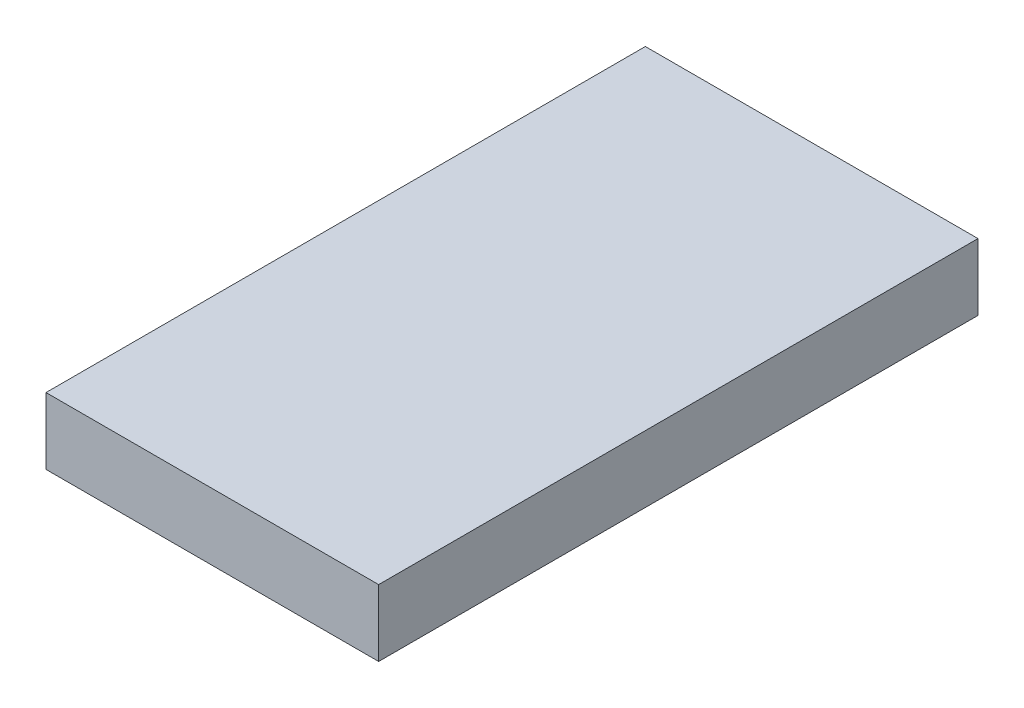
ISO-10303-21;
HEADER;
FILE_DESCRIPTION(('STEP AP214'),'2;1');
FILE_NAME('part.step','',(''),(''),'','','');
FILE_SCHEMA(('AUTOMOTIVE_DESIGN { 1 0 10303 214 1 1 1 1 }'));
ENDSEC;
DATA;
#1=APPLICATION_CONTEXT('core data for automotive mechanical design processes');
#2=APPLICATION_PROTOCOL_DEFINITION('international standard','automotive_design',2000,#1);
#3=PRODUCT_CONTEXT('',#1,'mechanical');
#4=PRODUCT('Part','Part','',(#3));
#5=PRODUCT_RELATED_PRODUCT_CATEGORY('part','',(#4));
#6=PRODUCT_DEFINITION_FORMATION('','',#4);
#7=PRODUCT_DEFINITION_CONTEXT('part definition',#1,'design');
#8=PRODUCT_DEFINITION('design','',#6,#7);
#9=PRODUCT_DEFINITION_SHAPE('','',#8);
#10=(LENGTH_UNIT() NAMED_UNIT(*) SI_UNIT(.MILLI.,.METRE.));
#11=(NAMED_UNIT(*) PLANE_ANGLE_UNIT() SI_UNIT($,.RADIAN.));
#12=(NAMED_UNIT(*) SI_UNIT($,.STERADIAN.) SOLID_ANGLE_UNIT());
#13=UNCERTAINTY_MEASURE_WITH_UNIT(LENGTH_MEASURE(1.E-05),#10,'distance_accuracy_value','');
#14=(GEOMETRIC_REPRESENTATION_CONTEXT(3) GLOBAL_UNCERTAINTY_ASSIGNED_CONTEXT((#13)) GLOBAL_UNIT_ASSIGNED_CONTEXT((#10,
#11,#12)) REPRESENTATION_CONTEXT('',''));
#15=CARTESIAN_POINT('',(0.,0.,0.));
#16=DIRECTION('',(0.,0.,1.));
#17=DIRECTION('',(1.,0.,0.));
#18=AXIS2_PLACEMENT_3D('',#15,#16,#17);
#19=CARTESIAN_POINT('',(63.43777,-12.7,228.6));
#20=DIRECTION('',(-1.,0.,0.));
#21=DIRECTION('',(0.,0.,1.));
#22=AXIS2_PLACEMENT_3D('',#19,#20,#21);
#23=PLANE('',#22);
#24=DIRECTION('',(0.,1.,0.));
#25=VECTOR('',#24,1.);
#26=CARTESIAN_POINT('',(63.43777,-12.7,0.));
#27=LINE('',#26,#25);
#28=CARTESIAN_POINT('',(63.43777,-12.7,0.));
#29=VERTEX_POINT('',#28);
#30=CARTESIAN_POINT('',(63.43777,12.7,0.));
#31=VERTEX_POINT('',#30);
#32=EDGE_CURVE('E106',#29,#31,#27,.T.);
#33=ORIENTED_EDGE('',*,*,#32,.T.);
#34=DIRECTION('',(0.,0.,-1.));
#35=VECTOR('',#34,1.);
#36=CARTESIAN_POINT('',(63.43777,12.7,228.6));
#37=LINE('',#36,#35);
#38=CARTESIAN_POINT('',(63.43777,12.7,228.6));
#39=VERTEX_POINT('',#38);
#40=EDGE_CURVE('E11',#39,#31,#37,.T.);
#41=ORIENTED_EDGE('',*,*,#40,.F.);
#42=DIRECTION('',(0.,1.,0.));
#43=VECTOR('',#42,1.);
#44=CARTESIAN_POINT('',(63.43777,-12.7,228.6));
#45=LINE('',#44,#43);
#46=CARTESIAN_POINT('',(63.43777,-12.7,228.6));
#47=VERTEX_POINT('',#46);
#48=EDGE_CURVE('E94',#47,#39,#45,.T.);
#49=ORIENTED_EDGE('',*,*,#48,.F.);
#50=DIRECTION('',(0.,0.,-1.));
#51=VECTOR('',#50,1.);
#52=CARTESIAN_POINT('',(63.43777,-12.7,228.6));
#53=LINE('',#52,#51);
#54=EDGE_CURVE('E102',#47,#29,#53,.T.);
#55=ORIENTED_EDGE('',*,*,#54,.T.);
#56=EDGE_LOOP('',(#33,#41,#49,#55));
#57=FACE_BOUND('',#56,.T.);
#58=ADVANCED_FACE('F43',(#57),#23,.F.);
#59=CARTESIAN_POINT('',(-63.43777,12.7,228.6));
#60=DIRECTION('',(0.,-1.,0.));
#61=DIRECTION('',(0.,0.,-1.));
#62=AXIS2_PLACEMENT_3D('',#59,#60,#61);
#63=PLANE('',#62);
#64=DIRECTION('',(-1.,0.,0.));
#65=VECTOR('',#64,1.);
#66=CARTESIAN_POINT('',(-63.43777,12.7,0.));
#67=LINE('',#66,#65);
#68=CARTESIAN_POINT('',(-63.43777,12.7,0.));
#69=VERTEX_POINT('',#68);
#70=EDGE_CURVE('E98',#31,#69,#67,.T.);
#71=ORIENTED_EDGE('',*,*,#70,.T.);
#72=DIRECTION('',(0.,0.,-1.));
#73=VECTOR('',#72,1.);
#74=CARTESIAN_POINT('',(-63.43777,12.7,228.6));
#75=LINE('',#74,#73);
#76=CARTESIAN_POINT('',(-63.43777,12.7,228.6));
#77=VERTEX_POINT('',#76);
#78=EDGE_CURVE('E51',#77,#69,#75,.T.);
#79=ORIENTED_EDGE('',*,*,#78,.F.);
#80=DIRECTION('',(-1.,0.,0.));
#81=VECTOR('',#80,1.);
#82=CARTESIAN_POINT('',(-63.43777,12.7,228.6));
#83=LINE('',#82,#81);
#84=EDGE_CURVE('E89',#39,#77,#83,.T.);
#85=ORIENTED_EDGE('',*,*,#84,.F.);
#86=ORIENTED_EDGE('',*,*,#40,.T.);
#87=EDGE_LOOP('',(#71,#79,#85,#86));
#88=FACE_BOUND('',#87,.T.);
#89=ADVANCED_FACE('F97',(#88),#63,.F.);
#90=CARTESIAN_POINT('',(-63.43777,-12.7,228.6));
#91=DIRECTION('',(1.,0.,0.));
#92=DIRECTION('',(0.,0.,-1.));
#93=AXIS2_PLACEMENT_3D('',#90,#91,#92);
#94=PLANE('',#93);
#95=DIRECTION('',(0.,-1.,0.));
#96=VECTOR('',#95,1.);
#97=CARTESIAN_POINT('',(-63.43777,-12.7,0.));
#98=LINE('',#97,#96);
#99=CARTESIAN_POINT('',(-63.43777,-12.7,0.));
#100=VERTEX_POINT('',#99);
#101=EDGE_CURVE('E76',#69,#100,#98,.T.);
#102=ORIENTED_EDGE('',*,*,#101,.T.);
#103=DIRECTION('',(0.,0.,-1.));
#104=VECTOR('',#103,1.);
#105=CARTESIAN_POINT('',(-63.43777,-12.7,228.6));
#106=LINE('',#105,#104);
#107=CARTESIAN_POINT('',(-63.43777,-12.7,228.6));
#108=VERTEX_POINT('',#107);
#109=EDGE_CURVE('E99',#108,#100,#106,.T.);
#110=ORIENTED_EDGE('',*,*,#109,.F.);
#111=DIRECTION('',(0.,-1.,0.));
#112=VECTOR('',#111,1.);
#113=CARTESIAN_POINT('',(-63.43777,-12.7,228.6));
#114=LINE('',#113,#112);
#115=EDGE_CURVE('E92',#77,#108,#114,.T.);
#116=ORIENTED_EDGE('',*,*,#115,.F.);
#117=ORIENTED_EDGE('',*,*,#78,.T.);
#118=EDGE_LOOP('',(#102,#110,#116,#117));
#119=FACE_BOUND('',#118,.T.);
#120=ADVANCED_FACE('F100',(#119),#94,.F.);
#121=CARTESIAN_POINT('',(-63.43777,-12.7,228.6));
#122=DIRECTION('',(0.,1.,0.));
#123=DIRECTION('',(0.,0.,1.));
#124=AXIS2_PLACEMENT_3D('',#121,#122,#123);
#125=PLANE('',#124);
#126=DIRECTION('',(1.,0.,0.));
#127=VECTOR('',#126,1.);
#128=CARTESIAN_POINT('',(-63.43777,-12.7,0.));
#129=LINE('',#128,#127);
#130=EDGE_CURVE('E82',#100,#29,#129,.T.);
#131=ORIENTED_EDGE('',*,*,#130,.T.);
#132=ORIENTED_EDGE('',*,*,#54,.F.);
#133=DIRECTION('',(1.,0.,0.));
#134=VECTOR('',#133,1.);
#135=CARTESIAN_POINT('',(-63.43777,-12.7,228.6));
#136=LINE('',#135,#134);
#137=EDGE_CURVE('E59',#108,#47,#136,.T.);
#138=ORIENTED_EDGE('',*,*,#137,.F.);
#139=ORIENTED_EDGE('',*,*,#109,.T.);
#140=EDGE_LOOP('',(#131,#132,#138,#139));
#141=FACE_BOUND('',#140,.T.);
#142=ADVANCED_FACE('F113',(#141),#125,.F.);
#143=CARTESIAN_POINT('',(0.,0.,228.6));
#144=DIRECTION('',(0.,0.,-1.));
#145=DIRECTION('',(-1.,0.,0.));
#146=AXIS2_PLACEMENT_3D('',#143,#144,#145);
#147=PLANE('',#146);
#148=ORIENTED_EDGE('',*,*,#48,.T.);
#149=ORIENTED_EDGE('',*,*,#84,.T.);
#150=ORIENTED_EDGE('',*,*,#115,.T.);
#151=ORIENTED_EDGE('',*,*,#137,.T.);
#152=EDGE_LOOP('',(#148,#149,#150,#151));
#153=FACE_BOUND('',#152,.T.);
#154=ADVANCED_FACE('F90',(#153),#147,.F.);
#155=CARTESIAN_POINT('',(0.,0.,0.));
#156=DIRECTION('',(0.,0.,-1.));
#157=DIRECTION('',(-1.,0.,0.));
#158=AXIS2_PLACEMENT_3D('',#155,#156,#157);
#159=PLANE('',#158);
#160=ORIENTED_EDGE('',*,*,#32,.F.);
#161=ORIENTED_EDGE('',*,*,#130,.F.);
#162=ORIENTED_EDGE('',*,*,#101,.F.);
#163=ORIENTED_EDGE('',*,*,#70,.F.);
#164=EDGE_LOOP('',(#160,#161,#162,#163));
#165=FACE_BOUND('',#164,.T.);
#166=ADVANCED_FACE('F116',(#165),#159,.T.);
#167=CLOSED_SHELL('',(#58,#89,#120,#142,#154,#166));
#168=MANIFOLD_SOLID_BREP('B2',#167);
#169=ADVANCED_BREP_SHAPE_REPRESENTATION('',(#18,#168),#14);
#170=SHAPE_DEFINITION_REPRESENTATION(#9,#169);
ENDSEC;
END-ISO-10303-21;
